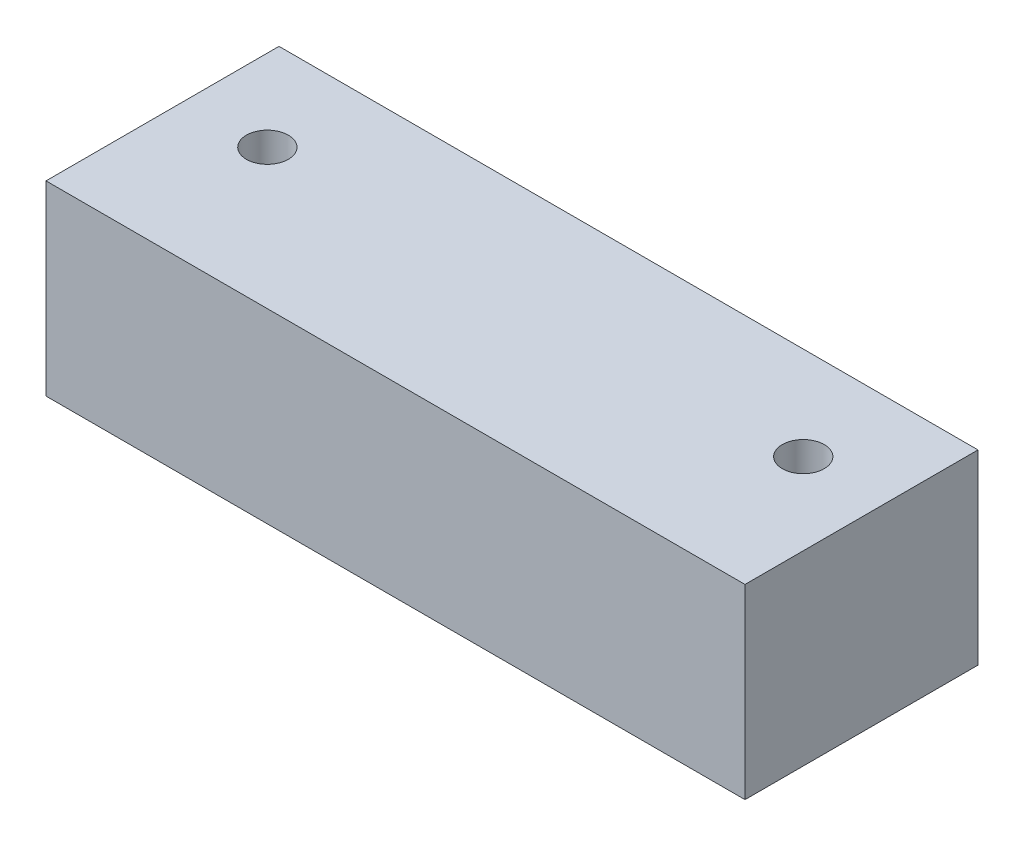
ISO-10303-21;
HEADER;
FILE_DESCRIPTION(('STEP AP214'),'2;1');
FILE_NAME('part.step','',(''),(''),'','','');
FILE_SCHEMA(('AUTOMOTIVE_DESIGN { 1 0 10303 214 1 1 1 1 }'));
ENDSEC;
DATA;
#1=APPLICATION_CONTEXT('core data for automotive mechanical design processes');
#2=APPLICATION_PROTOCOL_DEFINITION('international standard','automotive_design',2000,#1);
#3=PRODUCT_CONTEXT('',#1,'mechanical');
#4=PRODUCT('Part','Part','',(#3));
#5=PRODUCT_RELATED_PRODUCT_CATEGORY('part','',(#4));
#6=PRODUCT_DEFINITION_FORMATION('','',#4);
#7=PRODUCT_DEFINITION_CONTEXT('part definition',#1,'design');
#8=PRODUCT_DEFINITION('design','',#6,#7);
#9=PRODUCT_DEFINITION_SHAPE('','',#8);
#10=(LENGTH_UNIT() NAMED_UNIT(*) SI_UNIT(.MILLI.,.METRE.));
#11=(NAMED_UNIT(*) PLANE_ANGLE_UNIT() SI_UNIT($,.RADIAN.));
#12=(NAMED_UNIT(*) SI_UNIT($,.STERADIAN.) SOLID_ANGLE_UNIT());
#13=UNCERTAINTY_MEASURE_WITH_UNIT(LENGTH_MEASURE(1.E-05),#10,'distance_accuracy_value','');
#14=(GEOMETRIC_REPRESENTATION_CONTEXT(3) GLOBAL_UNCERTAINTY_ASSIGNED_CONTEXT((#13)) GLOBAL_UNIT_ASSIGNED_CONTEXT((#10,
#11,#12)) REPRESENTATION_CONTEXT('',''));
#15=CARTESIAN_POINT('',(0.,0.,0.));
#16=DIRECTION('',(0.,0.,1.));
#17=DIRECTION('',(1.,0.,0.));
#18=AXIS2_PLACEMENT_3D('',#15,#16,#17);
#19=CARTESIAN_POINT('',(-150.,-40.,50.));
#20=DIRECTION('',(1.,0.,0.));
#21=DIRECTION('',(0.,0.,-1.));
#22=AXIS2_PLACEMENT_3D('',#19,#20,#21);
#23=PLANE('',#22);
#24=DIRECTION('',(0.,-1.,0.));
#25=VECTOR('',#24,1.);
#26=CARTESIAN_POINT('',(-150.,-40.,-50.));
#27=LINE('',#26,#25);
#28=CARTESIAN_POINT('',(-150.,40.,-50.));
#29=VERTEX_POINT('',#28);
#30=CARTESIAN_POINT('',(-150.,-40.,-50.));
#31=VERTEX_POINT('',#30);
#32=EDGE_CURVE('E95',#29,#31,#27,.T.);
#33=ORIENTED_EDGE('',*,*,#32,.T.);
#34=DIRECTION('',(0.,0.,-1.));
#35=VECTOR('',#34,1.);
#36=CARTESIAN_POINT('',(-150.,-40.,50.));
#37=LINE('',#36,#35);
#38=CARTESIAN_POINT('',(-150.,-40.,50.));
#39=VERTEX_POINT('',#38);
#40=EDGE_CURVE('E11',#39,#31,#37,.T.);
#41=ORIENTED_EDGE('',*,*,#40,.F.);
#42=DIRECTION('',(0.,-1.,0.));
#43=VECTOR('',#42,1.);
#44=CARTESIAN_POINT('',(-150.,-40.,50.));
#45=LINE('',#44,#43);
#46=CARTESIAN_POINT('',(-150.,40.,50.));
#47=VERTEX_POINT('',#46);
#48=EDGE_CURVE('E83',#47,#39,#45,.T.);
#49=ORIENTED_EDGE('',*,*,#48,.F.);
#50=DIRECTION('',(0.,0.,-1.));
#51=VECTOR('',#50,1.);
#52=CARTESIAN_POINT('',(-150.,40.,50.));
#53=LINE('',#52,#51);
#54=EDGE_CURVE('E91',#47,#29,#53,.T.);
#55=ORIENTED_EDGE('',*,*,#54,.T.);
#56=EDGE_LOOP('',(#33,#41,#49,#55));
#57=FACE_BOUND('',#56,.T.);
#58=ADVANCED_FACE('F32',(#57),#23,.F.);
#59=CARTESIAN_POINT('',(-150.,-40.,50.));
#60=DIRECTION('',(0.,1.,0.));
#61=DIRECTION('',(0.,0.,1.));
#62=AXIS2_PLACEMENT_3D('',#59,#60,#61);
#63=PLANE('',#62);
#64=CARTESIAN_POINT('',(115.,-40.,-10.));
#65=DIRECTION('',(0.,1.,0.));
#66=DIRECTION('',(0.,0.,1.));
#67=AXIS2_PLACEMENT_3D('',#64,#65,#66);
#68=CIRCLE('',#67,9.);
#69=CARTESIAN_POINT('',(115.,-40.,-1.00000000000001));
#70=VERTEX_POINT('',#69);
#71=EDGE_CURVE('E114',#70,#70,#68,.T.);
#72=ORIENTED_EDGE('',*,*,#71,.T.);
#73=EDGE_LOOP('',(#72));
#74=FACE_BOUND('',#73,.T.);
#75=CARTESIAN_POINT('',(-115.,-40.,-10.));
#76=DIRECTION('',(0.,1.,0.));
#77=DIRECTION('',(0.,0.,1.));
#78=AXIS2_PLACEMENT_3D('',#75,#76,#77);
#79=CIRCLE('',#78,9.);
#80=CARTESIAN_POINT('',(-115.,-40.,-1.00000000000001));
#81=VERTEX_POINT('',#80);
#82=EDGE_CURVE('E98',#81,#81,#79,.T.);
#83=ORIENTED_EDGE('',*,*,#82,.T.);
#84=EDGE_LOOP('',(#83));
#85=FACE_BOUND('',#84,.T.);
#86=DIRECTION('',(1.,0.,0.));
#87=VECTOR('',#86,1.);
#88=CARTESIAN_POINT('',(-150.,-40.,-50.));
#89=LINE('',#88,#87);
#90=CARTESIAN_POINT('',(150.,-40.,-50.));
#91=VERTEX_POINT('',#90);
#92=EDGE_CURVE('E87',#31,#91,#89,.T.);
#93=ORIENTED_EDGE('',*,*,#92,.T.);
#94=DIRECTION('',(0.,0.,-1.));
#95=VECTOR('',#94,1.);
#96=CARTESIAN_POINT('',(150.,-40.,50.));
#97=LINE('',#96,#95);
#98=CARTESIAN_POINT('',(150.,-40.,50.));
#99=VERTEX_POINT('',#98);
#100=EDGE_CURVE('E40',#99,#91,#97,.T.);
#101=ORIENTED_EDGE('',*,*,#100,.F.);
#102=DIRECTION('',(1.,0.,0.));
#103=VECTOR('',#102,1.);
#104=CARTESIAN_POINT('',(-150.,-40.,50.));
#105=LINE('',#104,#103);
#106=EDGE_CURVE('E78',#39,#99,#105,.T.);
#107=ORIENTED_EDGE('',*,*,#106,.F.);
#108=ORIENTED_EDGE('',*,*,#40,.T.);
#109=EDGE_LOOP('',(#93,#101,#107,#108));
#110=FACE_BOUND('',#109,.T.);
#111=ADVANCED_FACE('F86',(#74,#85,#110),#63,.F.);
#112=CARTESIAN_POINT('',(150.,-40.,50.));
#113=DIRECTION('',(-1.,0.,0.));
#114=DIRECTION('',(0.,-1.,0.));
#115=AXIS2_PLACEMENT_3D('',#112,#113,#114);
#116=PLANE('',#115);
#117=DIRECTION('',(0.,1.,0.));
#118=VECTOR('',#117,1.);
#119=CARTESIAN_POINT('',(150.,-40.,-50.));
#120=LINE('',#119,#118);
#121=CARTESIAN_POINT('',(150.,40.,-50.));
#122=VERTEX_POINT('',#121);
#123=EDGE_CURVE('E65',#91,#122,#120,.T.);
#124=ORIENTED_EDGE('',*,*,#123,.T.);
#125=DIRECTION('',(0.,0.,-1.));
#126=VECTOR('',#125,1.);
#127=CARTESIAN_POINT('',(150.,40.,50.));
#128=LINE('',#127,#126);
#129=CARTESIAN_POINT('',(150.,40.,50.));
#130=VERTEX_POINT('',#129);
#131=EDGE_CURVE('E88',#130,#122,#128,.T.);
#132=ORIENTED_EDGE('',*,*,#131,.F.);
#133=DIRECTION('',(0.,1.,0.));
#134=VECTOR('',#133,1.);
#135=CARTESIAN_POINT('',(150.,-40.,50.));
#136=LINE('',#135,#134);
#137=EDGE_CURVE('E81',#99,#130,#136,.T.);
#138=ORIENTED_EDGE('',*,*,#137,.F.);
#139=ORIENTED_EDGE('',*,*,#100,.T.);
#140=EDGE_LOOP('',(#124,#132,#138,#139));
#141=FACE_BOUND('',#140,.T.);
#142=ADVANCED_FACE('F89',(#141),#116,.F.);
#143=CARTESIAN_POINT('',(-150.,40.,50.));
#144=DIRECTION('',(0.,-1.,0.));
#145=DIRECTION('',(1.,0.,0.));
#146=AXIS2_PLACEMENT_3D('',#143,#144,#145);
#147=PLANE('',#146);
#148=CARTESIAN_POINT('',(115.,40.,-10.));
#149=DIRECTION('',(0.,1.,0.));
#150=DIRECTION('',(0.,0.,1.));
#151=AXIS2_PLACEMENT_3D('',#148,#149,#150);
#152=CIRCLE('',#151,9.);
#153=CARTESIAN_POINT('',(115.,40.,-1.00000000000001));
#154=VERTEX_POINT('',#153);
#155=EDGE_CURVE('E117',#154,#154,#152,.T.);
#156=ORIENTED_EDGE('',*,*,#155,.F.);
#157=EDGE_LOOP('',(#156));
#158=FACE_BOUND('',#157,.T.);
#159=CARTESIAN_POINT('',(-115.,40.,-10.));
#160=DIRECTION('',(0.,1.,0.));
#161=DIRECTION('',(0.,0.,1.));
#162=AXIS2_PLACEMENT_3D('',#159,#160,#161);
#163=CIRCLE('',#162,9.);
#164=CARTESIAN_POINT('',(-115.,40.,-1.00000000000001));
#165=VERTEX_POINT('',#164);
#166=EDGE_CURVE('E111',#165,#165,#163,.T.);
#167=ORIENTED_EDGE('',*,*,#166,.F.);
#168=EDGE_LOOP('',(#167));
#169=FACE_BOUND('',#168,.T.);
#170=DIRECTION('',(-1.,0.,0.));
#171=VECTOR('',#170,1.);
#172=CARTESIAN_POINT('',(-150.,40.,-50.));
#173=LINE('',#172,#171);
#174=EDGE_CURVE('E71',#122,#29,#173,.T.);
#175=ORIENTED_EDGE('',*,*,#174,.T.);
#176=ORIENTED_EDGE('',*,*,#54,.F.);
#177=DIRECTION('',(-1.,0.,0.));
#178=VECTOR('',#177,1.);
#179=CARTESIAN_POINT('',(-150.,40.,50.));
#180=LINE('',#179,#178);
#181=EDGE_CURVE('E48',#130,#47,#180,.T.);
#182=ORIENTED_EDGE('',*,*,#181,.F.);
#183=ORIENTED_EDGE('',*,*,#131,.T.);
#184=EDGE_LOOP('',(#175,#176,#182,#183));
#185=FACE_BOUND('',#184,.T.);
#186=ADVANCED_FACE('F103',(#158,#169,#185),#147,.F.);
#187=CARTESIAN_POINT('',(0.,0.,50.));
#188=DIRECTION('',(0.,0.,-1.));
#189=DIRECTION('',(-1.,0.,0.));
#190=AXIS2_PLACEMENT_3D('',#187,#188,#189);
#191=PLANE('',#190);
#192=ORIENTED_EDGE('',*,*,#48,.T.);
#193=ORIENTED_EDGE('',*,*,#106,.T.);
#194=ORIENTED_EDGE('',*,*,#137,.T.);
#195=ORIENTED_EDGE('',*,*,#181,.T.);
#196=EDGE_LOOP('',(#192,#193,#194,#195));
#197=FACE_BOUND('',#196,.T.);
#198=ADVANCED_FACE('F79',(#197),#191,.F.);
#199=CARTESIAN_POINT('',(0.,0.,-50.));
#200=DIRECTION('',(0.,0.,-1.));
#201=DIRECTION('',(-1.,0.,0.));
#202=AXIS2_PLACEMENT_3D('',#199,#200,#201);
#203=PLANE('',#202);
#204=ORIENTED_EDGE('',*,*,#32,.F.);
#205=ORIENTED_EDGE('',*,*,#174,.F.);
#206=ORIENTED_EDGE('',*,*,#123,.F.);
#207=ORIENTED_EDGE('',*,*,#92,.F.);
#208=EDGE_LOOP('',(#204,#205,#206,#207));
#209=FACE_BOUND('',#208,.T.);
#210=ADVANCED_FACE('F106',(#209),#203,.T.);
#211=CARTESIAN_POINT('',(-115.,-40.,-10.));
#212=DIRECTION('',(0.,1.,0.));
#213=DIRECTION('',(0.,0.,1.));
#214=AXIS2_PLACEMENT_3D('',#211,#212,#213);
#215=CYLINDRICAL_SURFACE('',#214,9.);
#216=ORIENTED_EDGE('',*,*,#82,.F.);
#217=EDGE_LOOP('',(#216));
#218=FACE_BOUND('',#217,.T.);
#219=ORIENTED_EDGE('',*,*,#166,.T.);
#220=EDGE_LOOP('',(#219));
#221=FACE_BOUND('',#220,.T.);
#222=ADVANCED_FACE('F128',(#218,#221),#215,.F.);
#223=CARTESIAN_POINT('',(115.,-40.,-10.));
#224=DIRECTION('',(0.,1.,0.));
#225=DIRECTION('',(0.,0.,1.));
#226=AXIS2_PLACEMENT_3D('',#223,#224,#225);
#227=CYLINDRICAL_SURFACE('',#226,9.);
#228=ORIENTED_EDGE('',*,*,#71,.F.);
#229=EDGE_LOOP('',(#228));
#230=FACE_BOUND('',#229,.T.);
#231=ORIENTED_EDGE('',*,*,#155,.T.);
#232=EDGE_LOOP('',(#231));
#233=FACE_BOUND('',#232,.T.);
#234=ADVANCED_FACE('F121',(#230,#233),#227,.F.);
#235=CLOSED_SHELL('',(#58,#111,#142,#186,#198,#210,#222,#234));
#236=MANIFOLD_SOLID_BREP('B2',#235);
#237=ADVANCED_BREP_SHAPE_REPRESENTATION('',(#18,#236),#14);
#238=SHAPE_DEFINITION_REPRESENTATION(#9,#237);
ENDSEC;
END-ISO-10303-21;
